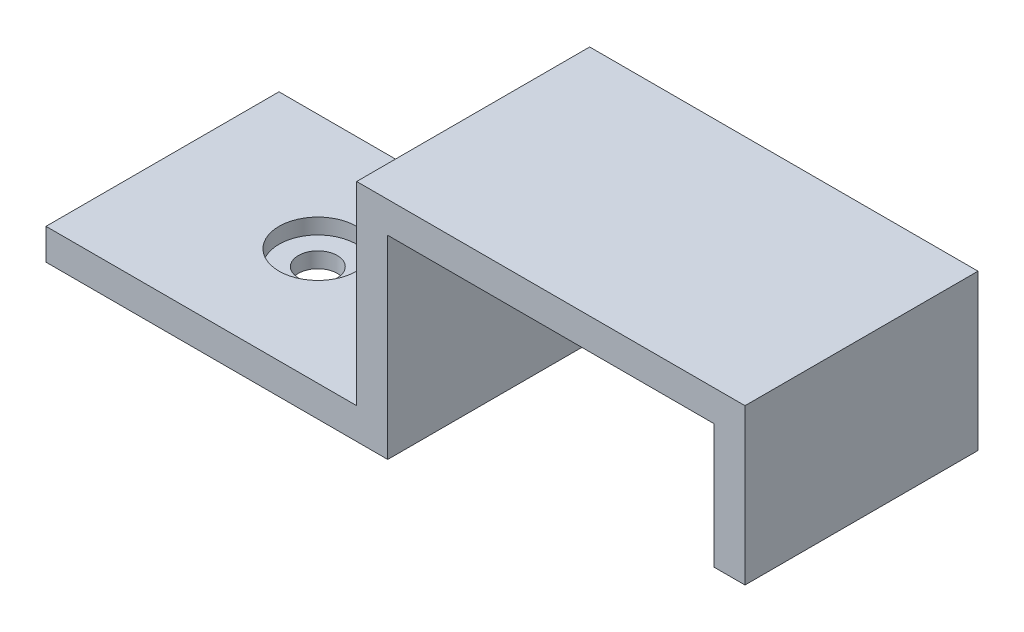
ISO-10303-21;
HEADER;
FILE_DESCRIPTION(('STEP AP214'),'2;1');
FILE_NAME('part.step','',(''),(''),'','','');
FILE_SCHEMA(('AUTOMOTIVE_DESIGN { 1 0 10303 214 1 1 1 1 }'));
ENDSEC;
DATA;
#1=APPLICATION_CONTEXT('core data for automotive mechanical design processes');
#2=APPLICATION_PROTOCOL_DEFINITION('international standard','automotive_design',2000,#1);
#3=PRODUCT_CONTEXT('',#1,'mechanical');
#4=PRODUCT('Part','Part','',(#3));
#5=PRODUCT_RELATED_PRODUCT_CATEGORY('part','',(#4));
#6=PRODUCT_DEFINITION_FORMATION('','',#4);
#7=PRODUCT_DEFINITION_CONTEXT('part definition',#1,'design');
#8=PRODUCT_DEFINITION('design','',#6,#7);
#9=PRODUCT_DEFINITION_SHAPE('','',#8);
#10=(LENGTH_UNIT() NAMED_UNIT(*) SI_UNIT(.MILLI.,.METRE.));
#11=(NAMED_UNIT(*) PLANE_ANGLE_UNIT() SI_UNIT($,.RADIAN.));
#12=(NAMED_UNIT(*) SI_UNIT($,.STERADIAN.) SOLID_ANGLE_UNIT());
#13=UNCERTAINTY_MEASURE_WITH_UNIT(LENGTH_MEASURE(1.E-05),#10,'distance_accuracy_value','');
#14=(GEOMETRIC_REPRESENTATION_CONTEXT(3) GLOBAL_UNCERTAINTY_ASSIGNED_CONTEXT((#13)) GLOBAL_UNIT_ASSIGNED_CONTEXT((#10,
#11,#12)) REPRESENTATION_CONTEXT('',''));
#15=CARTESIAN_POINT('',(0.,0.,0.));
#16=DIRECTION('',(0.,0.,1.));
#17=DIRECTION('',(1.,0.,0.));
#18=AXIS2_PLACEMENT_3D('',#15,#16,#17);
#19=CARTESIAN_POINT('',(0.,0.,0.));
#20=DIRECTION('',(0.,1.,0.));
#21=DIRECTION('',(0.,0.,1.));
#22=AXIS2_PLACEMENT_3D('',#19,#20,#21);
#23=CYLINDRICAL_SURFACE('',#22,2.5);
#24=CARTESIAN_POINT('',(0.,0.,0.));
#25=DIRECTION('',(0.,1.,0.));
#26=DIRECTION('',(0.,0.,1.));
#27=AXIS2_PLACEMENT_3D('',#24,#25,#26);
#28=CIRCLE('',#27,2.5);
#29=CARTESIAN_POINT('',(0.,0.,2.5));
#30=VERTEX_POINT('',#29);
#31=EDGE_CURVE('E115',#30,#30,#28,.T.);
#32=ORIENTED_EDGE('',*,*,#31,.F.);
#33=EDGE_LOOP('',(#32));
#34=FACE_BOUND('',#33,.T.);
#35=CARTESIAN_POINT('',(0.,2.,0.));
#36=DIRECTION('',(0.,1.,0.));
#37=DIRECTION('',(0.,0.,1.));
#38=AXIS2_PLACEMENT_3D('',#35,#36,#37);
#39=CIRCLE('',#38,2.5);
#40=CARTESIAN_POINT('',(0.,2.,2.5));
#41=VERTEX_POINT('',#40);
#42=EDGE_CURVE('E45',#41,#41,#39,.F.);
#43=ORIENTED_EDGE('',*,*,#42,.F.);
#44=EDGE_LOOP('',(#43));
#45=FACE_BOUND('',#44,.T.);
#46=ADVANCED_FACE('F41',(#34,#45),#23,.F.);
#47=CARTESIAN_POINT('',(-20.,4.,-15.));
#48=DIRECTION('',(0.,0.,1.));
#49=DIRECTION('',(1.,0.,0.));
#50=AXIS2_PLACEMENT_3D('',#47,#48,#49);
#51=PLANE('',#50);
#52=DIRECTION('',(-1.,0.,0.));
#53=VECTOR('',#52,1.);
#54=CARTESIAN_POINT('',(-20.,0.,-15.));
#55=LINE('',#54,#53);
#56=CARTESIAN_POINT('',(24.,0.,-15.));
#57=VERTEX_POINT('',#56);
#58=CARTESIAN_POINT('',(-20.,0.,-15.));
#59=VERTEX_POINT('',#58);
#60=EDGE_CURVE('E72',#57,#59,#55,.T.);
#61=ORIENTED_EDGE('',*,*,#60,.T.);
#62=DIRECTION('',(0.,-1.,0.));
#63=VECTOR('',#62,1.);
#64=CARTESIAN_POINT('',(-20.,4.,-15.));
#65=LINE('',#64,#63);
#66=CARTESIAN_POINT('',(-20.,4.,-15.));
#67=VERTEX_POINT('',#66);
#68=EDGE_CURVE('E11',#67,#59,#65,.T.);
#69=ORIENTED_EDGE('',*,*,#68,.F.);
#70=DIRECTION('',(-1.,0.,0.));
#71=VECTOR('',#70,1.);
#72=CARTESIAN_POINT('',(-20.,4.,-15.));
#73=LINE('',#72,#71);
#74=CARTESIAN_POINT('',(20.,4.,-15.));
#75=VERTEX_POINT('',#74);
#76=EDGE_CURVE('E101',#75,#67,#73,.T.);
#77=ORIENTED_EDGE('',*,*,#76,.F.);
#78=DIRECTION('',(0.,-1.,0.));
#79=VECTOR('',#78,1.);
#80=CARTESIAN_POINT('',(20.,0.,-15.));
#81=LINE('',#80,#79);
#82=CARTESIAN_POINT('',(20.,29.,-15.));
#83=VERTEX_POINT('',#82);
#84=EDGE_CURVE('E89',#83,#75,#81,.T.);
#85=ORIENTED_EDGE('',*,*,#84,.F.);
#86=DIRECTION('',(1.,0.,0.));
#87=VECTOR('',#86,1.);
#88=CARTESIAN_POINT('',(0.,29.,-15.));
#89=LINE('',#88,#87);
#90=CARTESIAN_POINT('',(70.,29.,-15.));
#91=VERTEX_POINT('',#90);
#92=EDGE_CURVE('E98',#83,#91,#89,.T.);
#93=ORIENTED_EDGE('',*,*,#92,.T.);
#94=DIRECTION('',(0.,-1.,0.));
#95=VECTOR('',#94,1.);
#96=CARTESIAN_POINT('',(70.,0.,-15.));
#97=LINE('',#96,#95);
#98=CARTESIAN_POINT('',(70.,9.,-15.));
#99=VERTEX_POINT('',#98);
#100=EDGE_CURVE('E182',#91,#99,#97,.T.);
#101=ORIENTED_EDGE('',*,*,#100,.T.);
#102=DIRECTION('',(1.,0.,0.));
#103=VECTOR('',#102,1.);
#104=CARTESIAN_POINT('',(0.,9.00000000000006,-15.));
#105=LINE('',#104,#103);
#106=CARTESIAN_POINT('',(66.,9.00000000000001,-15.));
#107=VERTEX_POINT('',#106);
#108=EDGE_CURVE('E186',#107,#99,#105,.T.);
#109=ORIENTED_EDGE('',*,*,#108,.F.);
#110=DIRECTION('',(0.,-1.,0.));
#111=VECTOR('',#110,1.);
#112=CARTESIAN_POINT('',(66.,0.,-15.));
#113=LINE('',#112,#111);
#114=CARTESIAN_POINT('',(66.,25.,-15.));
#115=VERTEX_POINT('',#114);
#116=EDGE_CURVE('E155',#115,#107,#113,.T.);
#117=ORIENTED_EDGE('',*,*,#116,.F.);
#118=DIRECTION('',(1.,0.,0.));
#119=VECTOR('',#118,1.);
#120=CARTESIAN_POINT('',(0.,25.,-15.));
#121=LINE('',#120,#119);
#122=CARTESIAN_POINT('',(24.,25.,-15.));
#123=VERTEX_POINT('',#122);
#124=EDGE_CURVE('E148',#123,#115,#121,.T.);
#125=ORIENTED_EDGE('',*,*,#124,.F.);
#126=DIRECTION('',(0.,1.,0.));
#127=VECTOR('',#126,1.);
#128=CARTESIAN_POINT('',(24.,0.,-15.));
#129=LINE('',#128,#127);
#130=EDGE_CURVE('E99',#57,#123,#129,.T.);
#131=ORIENTED_EDGE('',*,*,#130,.F.);
#132=EDGE_LOOP('',(#61,#69,#77,#85,#93,#101,#109,#117,#125,#131));
#133=FACE_BOUND('',#132,.T.);
#134=ADVANCED_FACE('F43',(#133),#51,.F.);
#135=CARTESIAN_POINT('',(-20.,4.,-15.));
#136=DIRECTION('',(1.,0.,0.));
#137=DIRECTION('',(0.,0.,-1.));
#138=AXIS2_PLACEMENT_3D('',#135,#136,#137);
#139=PLANE('',#138);
#140=DIRECTION('',(0.,0.,1.));
#141=VECTOR('',#140,1.);
#142=CARTESIAN_POINT('',(-20.,0.,-15.));
#143=LINE('',#142,#141);
#144=CARTESIAN_POINT('',(-20.,0.,15.));
#145=VERTEX_POINT('',#144);
#146=EDGE_CURVE('E112',#59,#145,#143,.T.);
#147=ORIENTED_EDGE('',*,*,#146,.T.);
#148=DIRECTION('',(0.,-1.,0.));
#149=VECTOR('',#148,1.);
#150=CARTESIAN_POINT('',(-20.,4.,15.));
#151=LINE('',#150,#149);
#152=CARTESIAN_POINT('',(-20.,4.,15.));
#153=VERTEX_POINT('',#152);
#154=EDGE_CURVE('E52',#153,#145,#151,.T.);
#155=ORIENTED_EDGE('',*,*,#154,.F.);
#156=DIRECTION('',(0.,0.,1.));
#157=VECTOR('',#156,1.);
#158=CARTESIAN_POINT('',(-20.,4.,-15.));
#159=LINE('',#158,#157);
#160=EDGE_CURVE('E60',#67,#153,#159,.T.);
#161=ORIENTED_EDGE('',*,*,#160,.F.);
#162=ORIENTED_EDGE('',*,*,#68,.T.);
#163=EDGE_LOOP('',(#147,#155,#161,#162));
#164=FACE_BOUND('',#163,.T.);
#165=ADVANCED_FACE('F278',(#164),#139,.F.);
#166=CARTESIAN_POINT('',(-20.,4.,15.));
#167=DIRECTION('',(0.,0.,-1.));
#168=DIRECTION('',(-1.,0.,0.));
#169=AXIS2_PLACEMENT_3D('',#166,#167,#168);
#170=PLANE('',#169);
#171=DIRECTION('',(1.,0.,0.));
#172=VECTOR('',#171,1.);
#173=CARTESIAN_POINT('',(-20.,0.,15.));
#174=LINE('',#173,#172);
#175=CARTESIAN_POINT('',(24.,0.,15.));
#176=VERTEX_POINT('',#175);
#177=EDGE_CURVE('E108',#145,#176,#174,.T.);
#178=ORIENTED_EDGE('',*,*,#177,.T.);
#179=DIRECTION('',(0.,-1.,0.));
#180=VECTOR('',#179,1.);
#181=CARTESIAN_POINT('',(24.,0.,15.));
#182=LINE('',#181,#180);
#183=CARTESIAN_POINT('',(24.,25.,15.));
#184=VERTEX_POINT('',#183);
#185=EDGE_CURVE('E165',#184,#176,#182,.T.);
#186=ORIENTED_EDGE('',*,*,#185,.F.);
#187=DIRECTION('',(-1.,0.,0.));
#188=VECTOR('',#187,1.);
#189=CARTESIAN_POINT('',(0.,25.,15.));
#190=LINE('',#189,#188);
#191=CARTESIAN_POINT('',(66.,25.,15.));
#192=VERTEX_POINT('',#191);
#193=EDGE_CURVE('E169',#192,#184,#190,.T.);
#194=ORIENTED_EDGE('',*,*,#193,.F.);
#195=DIRECTION('',(0.,1.,0.));
#196=VECTOR('',#195,1.);
#197=CARTESIAN_POINT('',(66.,0.,15.));
#198=LINE('',#197,#196);
#199=CARTESIAN_POINT('',(66.,9.00000000000001,15.));
#200=VERTEX_POINT('',#199);
#201=EDGE_CURVE('E174',#200,#192,#198,.T.);
#202=ORIENTED_EDGE('',*,*,#201,.F.);
#203=DIRECTION('',(-1.,0.,0.));
#204=VECTOR('',#203,1.);
#205=CARTESIAN_POINT('',(0.,9.00000000000006,15.));
#206=LINE('',#205,#204);
#207=CARTESIAN_POINT('',(70.,9.,15.));
#208=VERTEX_POINT('',#207);
#209=EDGE_CURVE('E247',#208,#200,#206,.T.);
#210=ORIENTED_EDGE('',*,*,#209,.F.);
#211=DIRECTION('',(0.,1.,0.));
#212=VECTOR('',#211,1.);
#213=CARTESIAN_POINT('',(70.,0.,15.));
#214=LINE('',#213,#212);
#215=CARTESIAN_POINT('',(70.,29.,15.));
#216=VERTEX_POINT('',#215);
#217=EDGE_CURVE('E255',#208,#216,#214,.T.);
#218=ORIENTED_EDGE('',*,*,#217,.T.);
#219=DIRECTION('',(-1.,0.,0.));
#220=VECTOR('',#219,1.);
#221=CARTESIAN_POINT('',(0.,29.,15.));
#222=LINE('',#221,#220);
#223=CARTESIAN_POINT('',(20.,29.,15.));
#224=VERTEX_POINT('',#223);
#225=EDGE_CURVE('E219',#216,#224,#222,.T.);
#226=ORIENTED_EDGE('',*,*,#225,.T.);
#227=DIRECTION('',(0.,1.,0.));
#228=VECTOR('',#227,1.);
#229=CARTESIAN_POINT('',(20.,0.,15.));
#230=LINE('',#229,#228);
#231=CARTESIAN_POINT('',(20.,4.,15.));
#232=VERTEX_POINT('',#231);
#233=EDGE_CURVE('E197',#232,#224,#230,.T.);
#234=ORIENTED_EDGE('',*,*,#233,.F.);
#235=DIRECTION('',(1.,0.,0.));
#236=VECTOR('',#235,1.);
#237=CARTESIAN_POINT('',(-20.,4.,15.));
#238=LINE('',#237,#236);
#239=EDGE_CURVE('E106',#153,#232,#238,.T.);
#240=ORIENTED_EDGE('',*,*,#239,.F.);
#241=ORIENTED_EDGE('',*,*,#154,.T.);
#242=EDGE_LOOP('',(#178,#186,#194,#202,#210,#218,#226,#234,#240,#241));
#243=FACE_BOUND('',#242,.T.);
#244=ADVANCED_FACE('F130',(#243),#170,.F.);
#245=CARTESIAN_POINT('',(0.,4.,0.));
#246=DIRECTION('',(0.,1.,0.));
#247=DIRECTION('',(0.,0.,1.));
#248=AXIS2_PLACEMENT_3D('',#245,#246,#247);
#249=PLANE('',#248);
#250=CARTESIAN_POINT('',(0.,4.,0.));
#251=DIRECTION('',(0.,1.,0.));
#252=DIRECTION('',(0.,0.,1.));
#253=AXIS2_PLACEMENT_3D('',#250,#251,#252);
#254=CIRCLE('',#253,5.);
#255=CARTESIAN_POINT('',(0.,4.,5.));
#256=VERTEX_POINT('',#255);
#257=EDGE_CURVE('E162',#256,#256,#254,.T.);
#258=ORIENTED_EDGE('',*,*,#257,.F.);
#259=EDGE_LOOP('',(#258));
#260=FACE_BOUND('',#259,.T.);
#261=DIRECTION('',(0.,0.,-1.));
#262=VECTOR('',#261,1.);
#263=CARTESIAN_POINT('',(20.,4.,-15.));
#264=LINE('',#263,#262);
#265=EDGE_CURVE('E81',#232,#75,#264,.T.);
#266=ORIENTED_EDGE('',*,*,#265,.T.);
#267=ORIENTED_EDGE('',*,*,#76,.T.);
#268=ORIENTED_EDGE('',*,*,#160,.T.);
#269=ORIENTED_EDGE('',*,*,#239,.T.);
#270=EDGE_LOOP('',(#266,#267,#268,#269));
#271=FACE_BOUND('',#270,.T.);
#272=ADVANCED_FACE('F104',(#260,#271),#249,.T.);
#273=CARTESIAN_POINT('',(0.,0.,0.));
#274=DIRECTION('',(0.,1.,0.));
#275=DIRECTION('',(0.,0.,1.));
#276=AXIS2_PLACEMENT_3D('',#273,#274,#275);
#277=PLANE('',#276);
#278=ORIENTED_EDGE('',*,*,#31,.T.);
#279=EDGE_LOOP('',(#278));
#280=FACE_BOUND('',#279,.T.);
#281=ORIENTED_EDGE('',*,*,#60,.F.);
#282=DIRECTION('',(0.,0.,-1.));
#283=VECTOR('',#282,1.);
#284=CARTESIAN_POINT('',(24.,0.,72.8013840664737));
#285=LINE('',#284,#283);
#286=EDGE_CURVE('E140',#176,#57,#285,.T.);
#287=ORIENTED_EDGE('',*,*,#286,.F.);
#288=ORIENTED_EDGE('',*,*,#177,.F.);
#289=ORIENTED_EDGE('',*,*,#146,.F.);
#290=EDGE_LOOP('',(#281,#287,#288,#289));
#291=FACE_BOUND('',#290,.T.);
#292=ADVANCED_FACE('F138',(#280,#291),#277,.F.);
#293=CARTESIAN_POINT('',(0.,2.,0.));
#294=DIRECTION('',(0.,1.,0.));
#295=DIRECTION('',(0.,0.,1.));
#296=AXIS2_PLACEMENT_3D('',#293,#294,#295);
#297=PLANE('',#296);
#298=CARTESIAN_POINT('',(0.,2.,0.));
#299=DIRECTION('',(0.,1.,0.));
#300=DIRECTION('',(0.,0.,1.));
#301=AXIS2_PLACEMENT_3D('',#298,#299,#300);
#302=CIRCLE('',#301,5.);
#303=CARTESIAN_POINT('',(0.,2.,5.));
#304=VERTEX_POINT('',#303);
#305=EDGE_CURVE('E159',#304,#304,#302,.T.);
#306=ORIENTED_EDGE('',*,*,#305,.T.);
#307=EDGE_LOOP('',(#306));
#308=FACE_BOUND('',#307,.T.);
#309=ORIENTED_EDGE('',*,*,#42,.T.);
#310=EDGE_LOOP('',(#309));
#311=FACE_BOUND('',#310,.T.);
#312=ADVANCED_FACE('F290',(#308,#311),#297,.T.);
#313=CARTESIAN_POINT('',(0.,2.,0.));
#314=DIRECTION('',(0.,1.,0.));
#315=DIRECTION('',(0.,0.,1.));
#316=AXIS2_PLACEMENT_3D('',#313,#314,#315);
#317=CYLINDRICAL_SURFACE('',#316,5.);
#318=ORIENTED_EDGE('',*,*,#305,.F.);
#319=EDGE_LOOP('',(#318));
#320=FACE_BOUND('',#319,.T.);
#321=ORIENTED_EDGE('',*,*,#257,.T.);
#322=EDGE_LOOP('',(#321));
#323=FACE_BOUND('',#322,.T.);
#324=ADVANCED_FACE('F283',(#320,#323),#317,.F.);
#325=CARTESIAN_POINT('',(20.,0.,72.8013840664737));
#326=DIRECTION('',(1.,0.,0.));
#327=DIRECTION('',(0.,0.,-1.));
#328=AXIS2_PLACEMENT_3D('',#325,#326,#327);
#329=PLANE('',#328);
#330=ORIENTED_EDGE('',*,*,#265,.F.);
#331=ORIENTED_EDGE('',*,*,#233,.T.);
#332=DIRECTION('',(0.,0.,-1.));
#333=VECTOR('',#332,1.);
#334=CARTESIAN_POINT('',(20.,29.,72.8013840664737));
#335=LINE('',#334,#333);
#336=EDGE_CURVE('E94',#224,#83,#335,.T.);
#337=ORIENTED_EDGE('',*,*,#336,.T.);
#338=ORIENTED_EDGE('',*,*,#84,.T.);
#339=EDGE_LOOP('',(#330,#331,#337,#338));
#340=FACE_BOUND('',#339,.T.);
#341=ADVANCED_FACE('F91',(#340),#329,.F.);
#342=CARTESIAN_POINT('',(0.,29.,72.8013840664737));
#343=DIRECTION('',(0.,1.,0.));
#344=DIRECTION('',(-1.,0.,0.));
#345=AXIS2_PLACEMENT_3D('',#342,#343,#344);
#346=PLANE('',#345);
#347=ORIENTED_EDGE('',*,*,#225,.F.);
#348=DIRECTION('',(0.,0.,-1.));
#349=VECTOR('',#348,1.);
#350=CARTESIAN_POINT('',(70.,29.,72.8013840664737));
#351=LINE('',#350,#349);
#352=EDGE_CURVE('E152',#216,#91,#351,.T.);
#353=ORIENTED_EDGE('',*,*,#352,.T.);
#354=ORIENTED_EDGE('',*,*,#92,.F.);
#355=ORIENTED_EDGE('',*,*,#336,.F.);
#356=EDGE_LOOP('',(#347,#353,#354,#355));
#357=FACE_BOUND('',#356,.T.);
#358=ADVANCED_FACE('F216',(#357),#346,.T.);
#359=CARTESIAN_POINT('',(70.,0.,72.8013840664737));
#360=DIRECTION('',(1.,0.,0.));
#361=DIRECTION('',(0.,0.,-1.));
#362=AXIS2_PLACEMENT_3D('',#359,#360,#361);
#363=PLANE('',#362);
#364=ORIENTED_EDGE('',*,*,#217,.F.);
#365=DIRECTION('',(0.,0.,-1.));
#366=VECTOR('',#365,1.);
#367=CARTESIAN_POINT('',(70.,9.,72.8013840664737));
#368=LINE('',#367,#366);
#369=EDGE_CURVE('E206',#208,#99,#368,.T.);
#370=ORIENTED_EDGE('',*,*,#369,.T.);
#371=ORIENTED_EDGE('',*,*,#100,.F.);
#372=ORIENTED_EDGE('',*,*,#352,.F.);
#373=EDGE_LOOP('',(#364,#370,#371,#372));
#374=FACE_BOUND('',#373,.T.);
#375=ADVANCED_FACE('F224',(#374),#363,.T.);
#376=CARTESIAN_POINT('',(0.,9.00000000000006,72.8013840664737));
#377=DIRECTION('',(0.,1.,0.));
#378=DIRECTION('',(-1.,0.,0.));
#379=AXIS2_PLACEMENT_3D('',#376,#377,#378);
#380=PLANE('',#379);
#381=ORIENTED_EDGE('',*,*,#369,.F.);
#382=ORIENTED_EDGE('',*,*,#209,.T.);
#383=DIRECTION('',(0.,0.,-1.));
#384=VECTOR('',#383,1.);
#385=CARTESIAN_POINT('',(66.,9.00000000000001,72.8013840664737));
#386=LINE('',#385,#384);
#387=EDGE_CURVE('E202',#200,#107,#386,.T.);
#388=ORIENTED_EDGE('',*,*,#387,.T.);
#389=ORIENTED_EDGE('',*,*,#108,.T.);
#390=EDGE_LOOP('',(#381,#382,#388,#389));
#391=FACE_BOUND('',#390,.T.);
#392=ADVANCED_FACE('F253',(#391),#380,.F.);
#393=CARTESIAN_POINT('',(66.,0.,72.8013840664737));
#394=DIRECTION('',(1.,0.,0.));
#395=DIRECTION('',(0.,0.,-1.));
#396=AXIS2_PLACEMENT_3D('',#393,#394,#395);
#397=PLANE('',#396);
#398=ORIENTED_EDGE('',*,*,#387,.F.);
#399=ORIENTED_EDGE('',*,*,#201,.T.);
#400=DIRECTION('',(0.,0.,-1.));
#401=VECTOR('',#400,1.);
#402=CARTESIAN_POINT('',(66.,25.,72.8013840664737));
#403=LINE('',#402,#401);
#404=EDGE_CURVE('E198',#192,#115,#403,.T.);
#405=ORIENTED_EDGE('',*,*,#404,.T.);
#406=ORIENTED_EDGE('',*,*,#116,.T.);
#407=EDGE_LOOP('',(#398,#399,#405,#406));
#408=FACE_BOUND('',#407,.T.);
#409=ADVANCED_FACE('F251',(#408),#397,.F.);
#410=CARTESIAN_POINT('',(0.,25.,72.8013840664737));
#411=DIRECTION('',(0.,1.,0.));
#412=DIRECTION('',(-1.,0.,0.));
#413=AXIS2_PLACEMENT_3D('',#410,#411,#412);
#414=PLANE('',#413);
#415=ORIENTED_EDGE('',*,*,#404,.F.);
#416=ORIENTED_EDGE('',*,*,#193,.T.);
#417=DIRECTION('',(0.,0.,-1.));
#418=VECTOR('',#417,1.);
#419=CARTESIAN_POINT('',(24.,25.,72.8013840664737));
#420=LINE('',#419,#418);
#421=EDGE_CURVE('E193',#184,#123,#420,.T.);
#422=ORIENTED_EDGE('',*,*,#421,.T.);
#423=ORIENTED_EDGE('',*,*,#124,.T.);
#424=EDGE_LOOP('',(#415,#416,#422,#423));
#425=FACE_BOUND('',#424,.T.);
#426=ADVANCED_FACE('F269',(#425),#414,.F.);
#427=CARTESIAN_POINT('',(24.,0.,72.8013840664737));
#428=DIRECTION('',(-1.,0.,0.));
#429=DIRECTION('',(0.,0.,1.));
#430=AXIS2_PLACEMENT_3D('',#427,#428,#429);
#431=PLANE('',#430);
#432=ORIENTED_EDGE('',*,*,#421,.F.);
#433=ORIENTED_EDGE('',*,*,#185,.T.);
#434=ORIENTED_EDGE('',*,*,#286,.T.);
#435=ORIENTED_EDGE('',*,*,#130,.T.);
#436=EDGE_LOOP('',(#432,#433,#434,#435));
#437=FACE_BOUND('',#436,.T.);
#438=ADVANCED_FACE('F359',(#437),#431,.F.);
#439=CLOSED_SHELL('',(#46,#134,#165,#244,#272,#292,#312,#324,#341,#358,#375,#392,#409,#426,#438));
#440=MANIFOLD_SOLID_BREP('B2',#439);
#441=ADVANCED_BREP_SHAPE_REPRESENTATION('',(#18,#440),#14);
#442=SHAPE_DEFINITION_REPRESENTATION(#9,#441);
ENDSEC;
END-ISO-10303-21;
